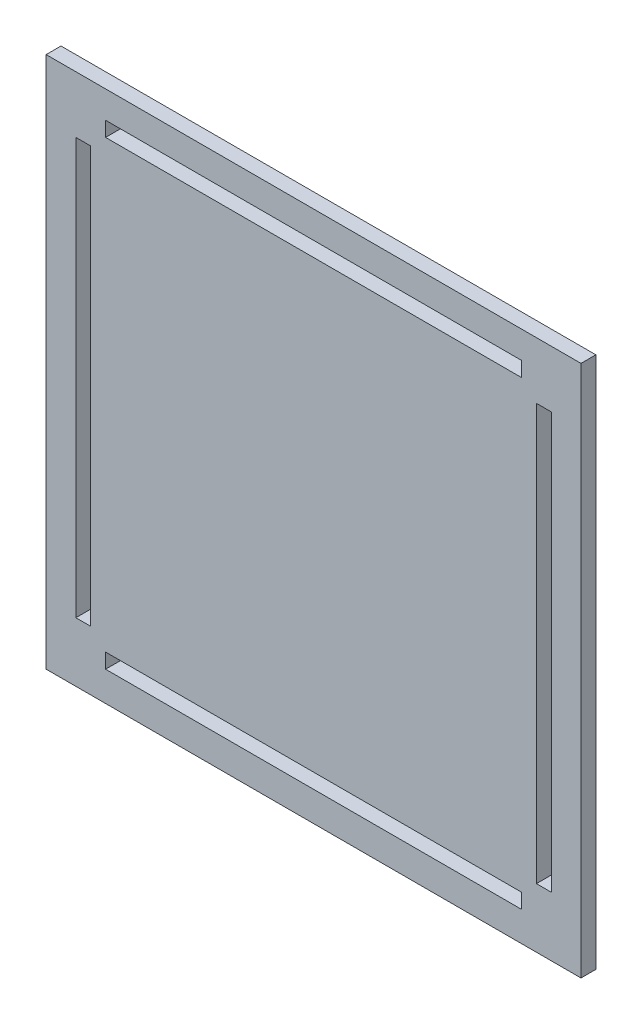
ISO-10303-21;
HEADER;
FILE_DESCRIPTION(('STEP AP214'),'2;1');
FILE_NAME('part.step','',(''),(''),'','','');
FILE_SCHEMA(('AUTOMOTIVE_DESIGN { 1 0 10303 214 1 1 1 1 }'));
ENDSEC;
DATA;
#1=APPLICATION_CONTEXT('core data for automotive mechanical design processes');
#2=APPLICATION_PROTOCOL_DEFINITION('international standard','automotive_design',2000,#1);
#3=PRODUCT_CONTEXT('',#1,'mechanical');
#4=PRODUCT('Part','Part','',(#3));
#5=PRODUCT_RELATED_PRODUCT_CATEGORY('part','',(#4));
#6=PRODUCT_DEFINITION_FORMATION('','',#4);
#7=PRODUCT_DEFINITION_CONTEXT('part definition',#1,'design');
#8=PRODUCT_DEFINITION('design','',#6,#7);
#9=PRODUCT_DEFINITION_SHAPE('','',#8);
#10=(LENGTH_UNIT() NAMED_UNIT(*) SI_UNIT(.MILLI.,.METRE.));
#11=(NAMED_UNIT(*) PLANE_ANGLE_UNIT() SI_UNIT($,.RADIAN.));
#12=(NAMED_UNIT(*) SI_UNIT($,.STERADIAN.) SOLID_ANGLE_UNIT());
#13=UNCERTAINTY_MEASURE_WITH_UNIT(LENGTH_MEASURE(1.E-05),#10,'distance_accuracy_value','');
#14=(GEOMETRIC_REPRESENTATION_CONTEXT(3) GLOBAL_UNCERTAINTY_ASSIGNED_CONTEXT((#13)) GLOBAL_UNIT_ASSIGNED_CONTEXT((#10,
#11,#12)) REPRESENTATION_CONTEXT('',''));
#15=CARTESIAN_POINT('',(0.,0.,0.));
#16=DIRECTION('',(0.,0.,1.));
#17=DIRECTION('',(1.,0.,0.));
#18=AXIS2_PLACEMENT_3D('',#15,#16,#17);
#19=CARTESIAN_POINT('',(0.,0.,5.));
#20=DIRECTION('',(0.,0.,1.));
#21=DIRECTION('',(1.,0.,0.));
#22=AXIS2_PLACEMENT_3D('',#19,#20,#21);
#23=PLANE('',#22);
#24=DIRECTION('',(0.,-1.,0.));
#25=VECTOR('',#24,1.);
#26=CARTESIAN_POINT('',(-90.,89.1405987204053,5.));
#27=LINE('',#26,#25);
#28=CARTESIAN_POINT('',(-90.,89.1405987204053,5.));
#29=VERTEX_POINT('',#28);
#30=CARTESIAN_POINT('',(-90.,-90.,5.));
#31=VERTEX_POINT('',#30);
#32=EDGE_CURVE('E309',#29,#31,#27,.T.);
#33=ORIENTED_EDGE('',*,*,#32,.T.);
#34=DIRECTION('',(1.,0.,0.));
#35=VECTOR('',#34,1.);
#36=CARTESIAN_POINT('',(-90.,-90.,5.));
#37=LINE('',#36,#35);
#38=CARTESIAN_POINT('',(90.,-90.,5.));
#39=VERTEX_POINT('',#38);
#40=EDGE_CURVE('E312',#31,#39,#37,.T.);
#41=ORIENTED_EDGE('',*,*,#40,.T.);
#42=DIRECTION('',(0.,1.,0.));
#43=VECTOR('',#42,1.);
#44=CARTESIAN_POINT('',(90.,89.1405987204053,5.));
#45=LINE('',#44,#43);
#46=CARTESIAN_POINT('',(90.,89.1405987204053,5.));
#47=VERTEX_POINT('',#46);
#48=EDGE_CURVE('E315',#39,#47,#45,.T.);
#49=ORIENTED_EDGE('',*,*,#48,.T.);
#50=DIRECTION('',(-1.,0.,0.));
#51=VECTOR('',#50,1.);
#52=CARTESIAN_POINT('',(-90.,89.1405987204053,5.));
#53=LINE('',#52,#51);
#54=EDGE_CURVE('E317',#47,#29,#53,.T.);
#55=ORIENTED_EDGE('',*,*,#54,.T.);
#56=EDGE_LOOP('',(#33,#41,#49,#55));
#57=FACE_BOUND('',#56,.T.);
#58=DIRECTION('',(0.,-1.,0.));
#59=VECTOR('',#58,1.);
#60=CARTESIAN_POINT('',(-70.0000000000001,80.0000000000041,5.));
#61=LINE('',#60,#59);
#62=CARTESIAN_POINT('',(-70.0000000000001,80.0000000000041,5.));
#63=VERTEX_POINT('',#62);
#64=CARTESIAN_POINT('',(-70.0000000000001,75.0000000000041,5.));
#65=VERTEX_POINT('',#64);
#66=EDGE_CURVE('E280',#63,#65,#61,.T.);
#67=ORIENTED_EDGE('',*,*,#66,.F.);
#68=DIRECTION('',(-1.,0.,0.));
#69=VECTOR('',#68,1.);
#70=CARTESIAN_POINT('',(69.9999999999999,80.0000000000041,5.));
#71=LINE('',#70,#69);
#72=CARTESIAN_POINT('',(69.9999999999999,80.0000000000041,5.));
#73=VERTEX_POINT('',#72);
#74=EDGE_CURVE('E278',#73,#63,#71,.T.);
#75=ORIENTED_EDGE('',*,*,#74,.F.);
#76=DIRECTION('',(0.,1.,0.));
#77=VECTOR('',#76,1.);
#78=CARTESIAN_POINT('',(69.9999999999999,80.0000000000041,5.));
#79=LINE('',#78,#77);
#80=CARTESIAN_POINT('',(69.9999999999999,75.0000000000041,5.));
#81=VERTEX_POINT('',#80);
#82=EDGE_CURVE('E286',#81,#73,#79,.T.);
#83=ORIENTED_EDGE('',*,*,#82,.F.);
#84=DIRECTION('',(1.,0.,0.));
#85=VECTOR('',#84,1.);
#86=CARTESIAN_POINT('',(69.9999999999999,75.0000000000041,5.));
#87=LINE('',#86,#85);
#88=EDGE_CURVE('E283',#65,#81,#87,.T.);
#89=ORIENTED_EDGE('',*,*,#88,.F.);
#90=EDGE_LOOP('',(#67,#75,#83,#89));
#91=FACE_BOUND('',#90,.T.);
#92=DIRECTION('',(1.,0.,0.));
#93=VECTOR('',#92,1.);
#94=CARTESIAN_POINT('',(-80.,-70.,5.));
#95=LINE('',#94,#93);
#96=CARTESIAN_POINT('',(-80.,-70.,5.));
#97=VERTEX_POINT('',#96);
#98=CARTESIAN_POINT('',(-75.,-70.,5.));
#99=VERTEX_POINT('',#98);
#100=EDGE_CURVE('E249',#97,#99,#95,.T.);
#101=ORIENTED_EDGE('',*,*,#100,.F.);
#102=DIRECTION('',(0.,-1.,0.));
#103=VECTOR('',#102,1.);
#104=CARTESIAN_POINT('',(-80.,70.,5.));
#105=LINE('',#104,#103);
#106=CARTESIAN_POINT('',(-80.,70.,5.));
#107=VERTEX_POINT('',#106);
#108=EDGE_CURVE('E247',#107,#97,#105,.T.);
#109=ORIENTED_EDGE('',*,*,#108,.F.);
#110=DIRECTION('',(-1.,0.,0.));
#111=VECTOR('',#110,1.);
#112=CARTESIAN_POINT('',(-80.,70.,5.));
#113=LINE('',#112,#111);
#114=CARTESIAN_POINT('',(-75.,70.,5.));
#115=VERTEX_POINT('',#114);
#116=EDGE_CURVE('E255',#115,#107,#113,.T.);
#117=ORIENTED_EDGE('',*,*,#116,.F.);
#118=DIRECTION('',(0.,1.,0.));
#119=VECTOR('',#118,1.);
#120=CARTESIAN_POINT('',(-75.,70.,5.));
#121=LINE('',#120,#119);
#122=EDGE_CURVE('E252',#99,#115,#121,.T.);
#123=ORIENTED_EDGE('',*,*,#122,.F.);
#124=EDGE_LOOP('',(#101,#109,#117,#123));
#125=FACE_BOUND('',#124,.T.);
#126=DIRECTION('',(-1.,0.,0.));
#127=VECTOR('',#126,1.);
#128=CARTESIAN_POINT('',(80.000000000004,70.0000000000042,5.));
#129=LINE('',#128,#127);
#130=CARTESIAN_POINT('',(80.000000000004,70.0000000000042,5.));
#131=VERTEX_POINT('',#130);
#132=CARTESIAN_POINT('',(75.000000000004,70.0000000000042,5.));
#133=VERTEX_POINT('',#132);
#134=EDGE_CURVE('E218',#131,#133,#129,.T.);
#135=ORIENTED_EDGE('',*,*,#134,.F.);
#136=DIRECTION('',(0.,1.,0.));
#137=VECTOR('',#136,1.);
#138=CARTESIAN_POINT('',(80.000000000004,-69.9999999999958,5.));
#139=LINE('',#138,#137);
#140=CARTESIAN_POINT('',(80.000000000004,-69.9999999999958,5.));
#141=VERTEX_POINT('',#140);
#142=EDGE_CURVE('E216',#141,#131,#139,.T.);
#143=ORIENTED_EDGE('',*,*,#142,.F.);
#144=DIRECTION('',(1.,0.,0.));
#145=VECTOR('',#144,1.);
#146=CARTESIAN_POINT('',(80.000000000004,-69.9999999999958,5.));
#147=LINE('',#146,#145);
#148=CARTESIAN_POINT('',(75.000000000004,-69.9999999999958,5.));
#149=VERTEX_POINT('',#148);
#150=EDGE_CURVE('E224',#149,#141,#147,.T.);
#151=ORIENTED_EDGE('',*,*,#150,.F.);
#152=DIRECTION('',(0.,-1.,0.));
#153=VECTOR('',#152,1.);
#154=CARTESIAN_POINT('',(75.000000000004,-69.9999999999958,5.));
#155=LINE('',#154,#153);
#156=EDGE_CURVE('E221',#133,#149,#155,.T.);
#157=ORIENTED_EDGE('',*,*,#156,.F.);
#158=EDGE_LOOP('',(#135,#143,#151,#157));
#159=FACE_BOUND('',#158,.T.);
#160=DIRECTION('',(0.,1.,0.));
#161=VECTOR('',#160,1.);
#162=CARTESIAN_POINT('',(70.0000000000041,-79.9999999999999,5.));
#163=LINE('',#162,#161);
#164=CARTESIAN_POINT('',(70.0000000000041,-79.9999999999999,5.));
#165=VERTEX_POINT('',#164);
#166=CARTESIAN_POINT('',(70.0000000000041,-74.9999999999999,5.));
#167=VERTEX_POINT('',#166);
#168=EDGE_CURVE('E188',#165,#167,#163,.T.);
#169=ORIENTED_EDGE('',*,*,#168,.F.);
#170=DIRECTION('',(1.,0.,0.));
#171=VECTOR('',#170,1.);
#172=CARTESIAN_POINT('',(-69.9999999999959,-79.9999999999999,5.));
#173=LINE('',#172,#171);
#174=CARTESIAN_POINT('',(-69.9999999999959,-79.9999999999999,5.));
#175=VERTEX_POINT('',#174);
#176=EDGE_CURVE('E180',#175,#165,#173,.T.);
#177=ORIENTED_EDGE('',*,*,#176,.F.);
#178=DIRECTION('',(0.,-1.,0.));
#179=VECTOR('',#178,1.);
#180=CARTESIAN_POINT('',(-69.9999999999959,-79.9999999999999,5.));
#181=LINE('',#180,#179);
#182=CARTESIAN_POINT('',(-69.9999999999959,-74.9999999999999,5.));
#183=VERTEX_POINT('',#182);
#184=EDGE_CURVE('E202',#183,#175,#181,.T.);
#185=ORIENTED_EDGE('',*,*,#184,.F.);
#186=DIRECTION('',(-1.,0.,0.));
#187=VECTOR('',#186,1.);
#188=CARTESIAN_POINT('',(-69.9999999999959,-74.9999999999999,5.));
#189=LINE('',#188,#187);
#190=EDGE_CURVE('E200',#167,#183,#189,.T.);
#191=ORIENTED_EDGE('',*,*,#190,.F.);
#192=EDGE_LOOP('',(#169,#177,#185,#191));
#193=FACE_BOUND('',#192,.T.);
#194=ADVANCED_FACE('F43',(#57,#91,#125,#159,#193),#23,.T.);
#195=CARTESIAN_POINT('',(0.,0.,0.));
#196=DIRECTION('',(0.,0.,1.));
#197=DIRECTION('',(1.,0.,0.));
#198=AXIS2_PLACEMENT_3D('',#195,#196,#197);
#199=PLANE('',#198);
#200=DIRECTION('',(0.,1.,0.));
#201=VECTOR('',#200,1.);
#202=CARTESIAN_POINT('',(80.000000000004,-69.9999999999958,0.));
#203=LINE('',#202,#201);
#204=CARTESIAN_POINT('',(80.000000000004,-69.9999999999958,0.));
#205=VERTEX_POINT('',#204);
#206=CARTESIAN_POINT('',(80.000000000004,70.0000000000042,0.));
#207=VERTEX_POINT('',#206);
#208=EDGE_CURVE('E196',#205,#207,#203,.T.);
#209=ORIENTED_EDGE('',*,*,#208,.T.);
#210=DIRECTION('',(-1.,0.,0.));
#211=VECTOR('',#210,1.);
#212=CARTESIAN_POINT('',(80.000000000004,70.0000000000042,0.));
#213=LINE('',#212,#211);
#214=CARTESIAN_POINT('',(75.000000000004,70.0000000000042,0.));
#215=VERTEX_POINT('',#214);
#216=EDGE_CURVE('E229',#207,#215,#213,.T.);
#217=ORIENTED_EDGE('',*,*,#216,.T.);
#218=DIRECTION('',(0.,-1.,0.));
#219=VECTOR('',#218,1.);
#220=CARTESIAN_POINT('',(75.000000000004,-69.9999999999958,0.));
#221=LINE('',#220,#219);
#222=CARTESIAN_POINT('',(75.000000000004,-69.9999999999958,0.));
#223=VERTEX_POINT('',#222);
#224=EDGE_CURVE('E232',#215,#223,#221,.T.);
#225=ORIENTED_EDGE('',*,*,#224,.T.);
#226=DIRECTION('',(1.,0.,0.));
#227=VECTOR('',#226,1.);
#228=CARTESIAN_POINT('',(80.000000000004,-69.9999999999958,0.));
#229=LINE('',#228,#227);
#230=EDGE_CURVE('E219',#223,#205,#229,.T.);
#231=ORIENTED_EDGE('',*,*,#230,.T.);
#232=EDGE_LOOP('',(#209,#217,#225,#231));
#233=FACE_BOUND('',#232,.T.);
#234=DIRECTION('',(-1.,0.,0.));
#235=VECTOR('',#234,1.);
#236=CARTESIAN_POINT('',(69.9999999999999,80.0000000000041,0.));
#237=LINE('',#236,#235);
#238=CARTESIAN_POINT('',(69.9999999999999,80.0000000000041,0.));
#239=VERTEX_POINT('',#238);
#240=CARTESIAN_POINT('',(-70.0000000000001,80.0000000000041,0.));
#241=VERTEX_POINT('',#240);
#242=EDGE_CURVE('E277',#239,#241,#237,.T.);
#243=ORIENTED_EDGE('',*,*,#242,.T.);
#244=DIRECTION('',(0.,-1.,0.));
#245=VECTOR('',#244,1.);
#246=CARTESIAN_POINT('',(-70.0000000000001,80.0000000000041,0.));
#247=LINE('',#246,#245);
#248=CARTESIAN_POINT('',(-70.0000000000001,75.0000000000041,0.));
#249=VERTEX_POINT('',#248);
#250=EDGE_CURVE('E291',#241,#249,#247,.T.);
#251=ORIENTED_EDGE('',*,*,#250,.T.);
#252=DIRECTION('',(1.,0.,0.));
#253=VECTOR('',#252,1.);
#254=CARTESIAN_POINT('',(69.9999999999999,75.0000000000041,0.));
#255=LINE('',#254,#253);
#256=CARTESIAN_POINT('',(69.9999999999999,75.0000000000041,0.));
#257=VERTEX_POINT('',#256);
#258=EDGE_CURVE('E294',#249,#257,#255,.T.);
#259=ORIENTED_EDGE('',*,*,#258,.T.);
#260=DIRECTION('',(0.,1.,0.));
#261=VECTOR('',#260,1.);
#262=CARTESIAN_POINT('',(69.9999999999999,80.0000000000041,0.));
#263=LINE('',#262,#261);
#264=EDGE_CURVE('E281',#257,#239,#263,.T.);
#265=ORIENTED_EDGE('',*,*,#264,.T.);
#266=EDGE_LOOP('',(#243,#251,#259,#265));
#267=FACE_BOUND('',#266,.T.);
#268=DIRECTION('',(0.,-1.,0.));
#269=VECTOR('',#268,1.);
#270=CARTESIAN_POINT('',(-90.,89.1405987204053,0.));
#271=LINE('',#270,#269);
#272=CARTESIAN_POINT('',(-90.,89.1405987204053,0.));
#273=VERTEX_POINT('',#272);
#274=CARTESIAN_POINT('',(-90.,-90.,0.));
#275=VERTEX_POINT('',#274);
#276=EDGE_CURVE('E308',#273,#275,#271,.T.);
#277=ORIENTED_EDGE('',*,*,#276,.F.);
#278=DIRECTION('',(-1.,0.,0.));
#279=VECTOR('',#278,1.);
#280=CARTESIAN_POINT('',(-90.,89.1405987204053,0.));
#281=LINE('',#280,#279);
#282=CARTESIAN_POINT('',(90.,89.1405987204053,0.));
#283=VERTEX_POINT('',#282);
#284=EDGE_CURVE('E313',#283,#273,#281,.T.);
#285=ORIENTED_EDGE('',*,*,#284,.F.);
#286=DIRECTION('',(0.,1.,0.));
#287=VECTOR('',#286,1.);
#288=CARTESIAN_POINT('',(90.,89.1405987204053,0.));
#289=LINE('',#288,#287);
#290=CARTESIAN_POINT('',(90.,-90.,0.));
#291=VERTEX_POINT('',#290);
#292=EDGE_CURVE('E324',#291,#283,#289,.T.);
#293=ORIENTED_EDGE('',*,*,#292,.F.);
#294=DIRECTION('',(1.,0.,0.));
#295=VECTOR('',#294,1.);
#296=CARTESIAN_POINT('',(-90.,-90.,0.));
#297=LINE('',#296,#295);
#298=EDGE_CURVE('E322',#275,#291,#297,.T.);
#299=ORIENTED_EDGE('',*,*,#298,.F.);
#300=EDGE_LOOP('',(#277,#285,#293,#299));
#301=FACE_BOUND('',#300,.T.);
#302=DIRECTION('',(0.,-1.,0.));
#303=VECTOR('',#302,1.);
#304=CARTESIAN_POINT('',(-80.,70.,0.));
#305=LINE('',#304,#303);
#306=CARTESIAN_POINT('',(-80.,70.,0.));
#307=VERTEX_POINT('',#306);
#308=CARTESIAN_POINT('',(-80.,-70.,0.));
#309=VERTEX_POINT('',#308);
#310=EDGE_CURVE('E246',#307,#309,#305,.T.);
#311=ORIENTED_EDGE('',*,*,#310,.T.);
#312=DIRECTION('',(1.,0.,0.));
#313=VECTOR('',#312,1.);
#314=CARTESIAN_POINT('',(-80.,-70.,0.));
#315=LINE('',#314,#313);
#316=CARTESIAN_POINT('',(-75.,-70.,0.));
#317=VERTEX_POINT('',#316);
#318=EDGE_CURVE('E260',#309,#317,#315,.T.);
#319=ORIENTED_EDGE('',*,*,#318,.T.);
#320=DIRECTION('',(0.,1.,0.));
#321=VECTOR('',#320,1.);
#322=CARTESIAN_POINT('',(-75.,70.,0.));
#323=LINE('',#322,#321);
#324=CARTESIAN_POINT('',(-75.,70.,0.));
#325=VERTEX_POINT('',#324);
#326=EDGE_CURVE('E263',#317,#325,#323,.T.);
#327=ORIENTED_EDGE('',*,*,#326,.T.);
#328=DIRECTION('',(-1.,0.,0.));
#329=VECTOR('',#328,1.);
#330=CARTESIAN_POINT('',(-80.,70.,0.));
#331=LINE('',#330,#329);
#332=EDGE_CURVE('E250',#325,#307,#331,.T.);
#333=ORIENTED_EDGE('',*,*,#332,.T.);
#334=EDGE_LOOP('',(#311,#319,#327,#333));
#335=FACE_BOUND('',#334,.T.);
#336=DIRECTION('',(1.,0.,0.));
#337=VECTOR('',#336,1.);
#338=CARTESIAN_POINT('',(-69.9999999999959,-79.9999999999999,0.));
#339=LINE('',#338,#337);
#340=CARTESIAN_POINT('',(-69.9999999999959,-79.9999999999999,0.));
#341=VERTEX_POINT('',#340);
#342=CARTESIAN_POINT('',(70.0000000000041,-79.9999999999999,0.));
#343=VERTEX_POINT('',#342);
#344=EDGE_CURVE('E66',#341,#343,#339,.T.);
#345=ORIENTED_EDGE('',*,*,#344,.T.);
#346=DIRECTION('',(0.,1.,0.));
#347=VECTOR('',#346,1.);
#348=CARTESIAN_POINT('',(70.0000000000041,-79.9999999999999,0.));
#349=LINE('',#348,#347);
#350=CARTESIAN_POINT('',(70.0000000000041,-74.9999999999999,0.));
#351=VERTEX_POINT('',#350);
#352=EDGE_CURVE('E195',#343,#351,#349,.T.);
#353=ORIENTED_EDGE('',*,*,#352,.T.);
#354=DIRECTION('',(-1.,0.,0.));
#355=VECTOR('',#354,1.);
#356=CARTESIAN_POINT('',(-69.9999999999959,-74.9999999999999,0.));
#357=LINE('',#356,#355);
#358=CARTESIAN_POINT('',(-69.9999999999959,-74.9999999999999,0.));
#359=VERTEX_POINT('',#358);
#360=EDGE_CURVE('E208',#351,#359,#357,.T.);
#361=ORIENTED_EDGE('',*,*,#360,.T.);
#362=DIRECTION('',(0.,-1.,0.));
#363=VECTOR('',#362,1.);
#364=CARTESIAN_POINT('',(-69.9999999999959,-79.9999999999999,0.));
#365=LINE('',#364,#363);
#366=EDGE_CURVE('E189',#359,#341,#365,.T.);
#367=ORIENTED_EDGE('',*,*,#366,.T.);
#368=EDGE_LOOP('',(#345,#353,#361,#367));
#369=FACE_BOUND('',#368,.T.);
#370=ADVANCED_FACE('F342',(#233,#267,#301,#335,#369),#199,.F.);
#371=CARTESIAN_POINT('',(-90.,89.1405987204053,5.));
#372=DIRECTION('',(1.,0.,0.));
#373=DIRECTION('',(0.,1.,0.));
#374=AXIS2_PLACEMENT_3D('',#371,#372,#373);
#375=PLANE('',#374);
#376=ORIENTED_EDGE('',*,*,#276,.T.);
#377=DIRECTION('',(0.,0.,-1.));
#378=VECTOR('',#377,1.);
#379=CARTESIAN_POINT('',(-90.,-90.,5.));
#380=LINE('',#379,#378);
#381=EDGE_CURVE('E11',#31,#275,#380,.T.);
#382=ORIENTED_EDGE('',*,*,#381,.F.);
#383=ORIENTED_EDGE('',*,*,#32,.F.);
#384=DIRECTION('',(0.,0.,-1.));
#385=VECTOR('',#384,1.);
#386=CARTESIAN_POINT('',(-90.,89.1405987204053,5.));
#387=LINE('',#386,#385);
#388=EDGE_CURVE('E319',#29,#273,#387,.T.);
#389=ORIENTED_EDGE('',*,*,#388,.T.);
#390=EDGE_LOOP('',(#376,#382,#383,#389));
#391=FACE_BOUND('',#390,.T.);
#392=ADVANCED_FACE('F45',(#391),#375,.F.);
#393=CARTESIAN_POINT('',(-90.,-90.,5.));
#394=DIRECTION('',(0.,1.,0.));
#395=DIRECTION('',(0.,0.,1.));
#396=AXIS2_PLACEMENT_3D('',#393,#394,#395);
#397=PLANE('',#396);
#398=ORIENTED_EDGE('',*,*,#298,.T.);
#399=DIRECTION('',(0.,0.,-1.));
#400=VECTOR('',#399,1.);
#401=CARTESIAN_POINT('',(90.,-90.,5.));
#402=LINE('',#401,#400);
#403=EDGE_CURVE('E51',#39,#291,#402,.T.);
#404=ORIENTED_EDGE('',*,*,#403,.F.);
#405=ORIENTED_EDGE('',*,*,#40,.F.);
#406=ORIENTED_EDGE('',*,*,#381,.T.);
#407=EDGE_LOOP('',(#398,#404,#405,#406));
#408=FACE_BOUND('',#407,.T.);
#409=ADVANCED_FACE('F353',(#408),#397,.F.);
#410=CARTESIAN_POINT('',(90.,89.1405987204053,5.));
#411=DIRECTION('',(-1.,0.,0.));
#412=DIRECTION('',(0.,-1.,0.));
#413=AXIS2_PLACEMENT_3D('',#410,#411,#412);
#414=PLANE('',#413);
#415=ORIENTED_EDGE('',*,*,#292,.T.);
#416=DIRECTION('',(0.,0.,-1.));
#417=VECTOR('',#416,1.);
#418=CARTESIAN_POINT('',(90.,89.1405987204053,5.));
#419=LINE('',#418,#417);
#420=EDGE_CURVE('E329',#47,#283,#419,.T.);
#421=ORIENTED_EDGE('',*,*,#420,.F.);
#422=ORIENTED_EDGE('',*,*,#48,.F.);
#423=ORIENTED_EDGE('',*,*,#403,.T.);
#424=EDGE_LOOP('',(#415,#421,#422,#423));
#425=FACE_BOUND('',#424,.T.);
#426=ADVANCED_FACE('F336',(#425),#414,.F.);
#427=CARTESIAN_POINT('',(-90.,89.1405987204053,5.));
#428=DIRECTION('',(0.,-1.,0.));
#429=DIRECTION('',(0.,0.,-1.));
#430=AXIS2_PLACEMENT_3D('',#427,#428,#429);
#431=PLANE('',#430);
#432=ORIENTED_EDGE('',*,*,#284,.T.);
#433=ORIENTED_EDGE('',*,*,#388,.F.);
#434=ORIENTED_EDGE('',*,*,#54,.F.);
#435=ORIENTED_EDGE('',*,*,#420,.T.);
#436=EDGE_LOOP('',(#432,#433,#434,#435));
#437=FACE_BOUND('',#436,.T.);
#438=ADVANCED_FACE('F346',(#437),#431,.F.);
#439=CARTESIAN_POINT('',(69.9999999999999,80.0000000000041,5.));
#440=DIRECTION('',(0.,-1.,0.));
#441=DIRECTION('',(1.,0.,0.));
#442=AXIS2_PLACEMENT_3D('',#439,#440,#441);
#443=PLANE('',#442);
#444=ORIENTED_EDGE('',*,*,#242,.F.);
#445=DIRECTION('',(0.,0.,-1.));
#446=VECTOR('',#445,1.);
#447=CARTESIAN_POINT('',(69.9999999999999,80.0000000000041,5.));
#448=LINE('',#447,#446);
#449=EDGE_CURVE('E288',#73,#239,#448,.T.);
#450=ORIENTED_EDGE('',*,*,#449,.F.);
#451=ORIENTED_EDGE('',*,*,#74,.T.);
#452=DIRECTION('',(0.,0.,-1.));
#453=VECTOR('',#452,1.);
#454=CARTESIAN_POINT('',(-70.0000000000001,80.0000000000041,5.));
#455=LINE('',#454,#453);
#456=EDGE_CURVE('E305',#63,#241,#455,.T.);
#457=ORIENTED_EDGE('',*,*,#456,.T.);
#458=EDGE_LOOP('',(#444,#450,#451,#457));
#459=FACE_BOUND('',#458,.T.);
#460=ADVANCED_FACE('F368',(#459),#443,.T.);
#461=CARTESIAN_POINT('',(-70.0000000000001,80.0000000000041,5.));
#462=DIRECTION('',(1.,0.,0.));
#463=DIRECTION('',(0.,0.,-1.));
#464=AXIS2_PLACEMENT_3D('',#461,#462,#463);
#465=PLANE('',#464);
#466=ORIENTED_EDGE('',*,*,#250,.F.);
#467=ORIENTED_EDGE('',*,*,#456,.F.);
#468=ORIENTED_EDGE('',*,*,#66,.T.);
#469=DIRECTION('',(0.,0.,-1.));
#470=VECTOR('',#469,1.);
#471=CARTESIAN_POINT('',(-70.0000000000001,75.0000000000041,5.));
#472=LINE('',#471,#470);
#473=EDGE_CURVE('E303',#65,#249,#472,.T.);
#474=ORIENTED_EDGE('',*,*,#473,.T.);
#475=EDGE_LOOP('',(#466,#467,#468,#474));
#476=FACE_BOUND('',#475,.T.);
#477=ADVANCED_FACE('F375',(#476),#465,.T.);
#478=CARTESIAN_POINT('',(69.9999999999999,75.0000000000041,5.));
#479=DIRECTION('',(0.,1.,0.));
#480=DIRECTION('',(-1.,0.,0.));
#481=AXIS2_PLACEMENT_3D('',#478,#479,#480);
#482=PLANE('',#481);
#483=ORIENTED_EDGE('',*,*,#258,.F.);
#484=ORIENTED_EDGE('',*,*,#473,.F.);
#485=ORIENTED_EDGE('',*,*,#88,.T.);
#486=DIRECTION('',(0.,0.,-1.));
#487=VECTOR('',#486,1.);
#488=CARTESIAN_POINT('',(69.9999999999999,75.0000000000041,5.));
#489=LINE('',#488,#487);
#490=EDGE_CURVE('E301',#81,#257,#489,.T.);
#491=ORIENTED_EDGE('',*,*,#490,.T.);
#492=EDGE_LOOP('',(#483,#484,#485,#491));
#493=FACE_BOUND('',#492,.T.);
#494=ADVANCED_FACE('F380',(#493),#482,.T.);
#495=CARTESIAN_POINT('',(69.9999999999999,80.0000000000041,5.));
#496=DIRECTION('',(-1.,0.,0.));
#497=DIRECTION('',(0.,0.,1.));
#498=AXIS2_PLACEMENT_3D('',#495,#496,#497);
#499=PLANE('',#498);
#500=ORIENTED_EDGE('',*,*,#264,.F.);
#501=ORIENTED_EDGE('',*,*,#490,.F.);
#502=ORIENTED_EDGE('',*,*,#82,.T.);
#503=ORIENTED_EDGE('',*,*,#449,.T.);
#504=EDGE_LOOP('',(#500,#501,#502,#503));
#505=FACE_BOUND('',#504,.T.);
#506=ADVANCED_FACE('F388',(#505),#499,.T.);
#507=CARTESIAN_POINT('',(-80.,70.,5.));
#508=DIRECTION('',(1.,0.,0.));
#509=DIRECTION('',(0.,1.,0.));
#510=AXIS2_PLACEMENT_3D('',#507,#508,#509);
#511=PLANE('',#510);
#512=ORIENTED_EDGE('',*,*,#310,.F.);
#513=DIRECTION('',(0.,0.,-1.));
#514=VECTOR('',#513,1.);
#515=CARTESIAN_POINT('',(-80.,70.,5.));
#516=LINE('',#515,#514);
#517=EDGE_CURVE('E257',#107,#307,#516,.T.);
#518=ORIENTED_EDGE('',*,*,#517,.F.);
#519=ORIENTED_EDGE('',*,*,#108,.T.);
#520=DIRECTION('',(0.,0.,-1.));
#521=VECTOR('',#520,1.);
#522=CARTESIAN_POINT('',(-80.,-70.,5.));
#523=LINE('',#522,#521);
#524=EDGE_CURVE('E274',#97,#309,#523,.T.);
#525=ORIENTED_EDGE('',*,*,#524,.T.);
#526=EDGE_LOOP('',(#512,#518,#519,#525));
#527=FACE_BOUND('',#526,.T.);
#528=ADVANCED_FACE('F442',(#527),#511,.T.);
#529=CARTESIAN_POINT('',(-80.,-70.,5.));
#530=DIRECTION('',(0.,1.,0.));
#531=DIRECTION('',(0.,0.,1.));
#532=AXIS2_PLACEMENT_3D('',#529,#530,#531);
#533=PLANE('',#532);
#534=ORIENTED_EDGE('',*,*,#318,.F.);
#535=ORIENTED_EDGE('',*,*,#524,.F.);
#536=ORIENTED_EDGE('',*,*,#100,.T.);
#537=DIRECTION('',(0.,0.,-1.));
#538=VECTOR('',#537,1.);
#539=CARTESIAN_POINT('',(-75.,-70.,5.));
#540=LINE('',#539,#538);
#541=EDGE_CURVE('E272',#99,#317,#540,.T.);
#542=ORIENTED_EDGE('',*,*,#541,.T.);
#543=EDGE_LOOP('',(#534,#535,#536,#542));
#544=FACE_BOUND('',#543,.T.);
#545=ADVANCED_FACE('F438',(#544),#533,.T.);
#546=CARTESIAN_POINT('',(-75.,70.,5.));
#547=DIRECTION('',(-1.,0.,0.));
#548=DIRECTION('',(0.,-1.,0.));
#549=AXIS2_PLACEMENT_3D('',#546,#547,#548);
#550=PLANE('',#549);
#551=ORIENTED_EDGE('',*,*,#326,.F.);
#552=ORIENTED_EDGE('',*,*,#541,.F.);
#553=ORIENTED_EDGE('',*,*,#122,.T.);
#554=DIRECTION('',(0.,0.,-1.));
#555=VECTOR('',#554,1.);
#556=CARTESIAN_POINT('',(-75.,70.,5.));
#557=LINE('',#556,#555);
#558=EDGE_CURVE('E270',#115,#325,#557,.T.);
#559=ORIENTED_EDGE('',*,*,#558,.T.);
#560=EDGE_LOOP('',(#551,#552,#553,#559));
#561=FACE_BOUND('',#560,.T.);
#562=ADVANCED_FACE('F434',(#561),#550,.T.);
#563=CARTESIAN_POINT('',(-80.,70.,5.));
#564=DIRECTION('',(0.,-1.,0.));
#565=DIRECTION('',(0.,0.,-1.));
#566=AXIS2_PLACEMENT_3D('',#563,#564,#565);
#567=PLANE('',#566);
#568=ORIENTED_EDGE('',*,*,#332,.F.);
#569=ORIENTED_EDGE('',*,*,#558,.F.);
#570=ORIENTED_EDGE('',*,*,#116,.T.);
#571=ORIENTED_EDGE('',*,*,#517,.T.);
#572=EDGE_LOOP('',(#568,#569,#570,#571));
#573=FACE_BOUND('',#572,.T.);
#574=ADVANCED_FACE('F431',(#573),#567,.T.);
#575=CARTESIAN_POINT('',(80.000000000004,-69.9999999999958,5.));
#576=DIRECTION('',(-1.,0.,0.));
#577=DIRECTION('',(0.,-1.,0.));
#578=AXIS2_PLACEMENT_3D('',#575,#576,#577);
#579=PLANE('',#578);
#580=ORIENTED_EDGE('',*,*,#208,.F.);
#581=DIRECTION('',(0.,0.,-1.));
#582=VECTOR('',#581,1.);
#583=CARTESIAN_POINT('',(80.000000000004,-69.9999999999958,5.));
#584=LINE('',#583,#582);
#585=EDGE_CURVE('E226',#141,#205,#584,.T.);
#586=ORIENTED_EDGE('',*,*,#585,.F.);
#587=ORIENTED_EDGE('',*,*,#142,.T.);
#588=DIRECTION('',(0.,0.,-1.));
#589=VECTOR('',#588,1.);
#590=CARTESIAN_POINT('',(80.000000000004,70.0000000000042,5.));
#591=LINE('',#590,#589);
#592=EDGE_CURVE('E243',#131,#207,#591,.T.);
#593=ORIENTED_EDGE('',*,*,#592,.T.);
#594=EDGE_LOOP('',(#580,#586,#587,#593));
#595=FACE_BOUND('',#594,.T.);
#596=ADVANCED_FACE('F413',(#595),#579,.T.);
#597=CARTESIAN_POINT('',(80.000000000004,70.0000000000042,5.));
#598=DIRECTION('',(0.,-1.,0.));
#599=DIRECTION('',(0.,0.,-1.));
#600=AXIS2_PLACEMENT_3D('',#597,#598,#599);
#601=PLANE('',#600);
#602=ORIENTED_EDGE('',*,*,#216,.F.);
#603=ORIENTED_EDGE('',*,*,#592,.F.);
#604=ORIENTED_EDGE('',*,*,#134,.T.);
#605=DIRECTION('',(0.,0.,-1.));
#606=VECTOR('',#605,1.);
#607=CARTESIAN_POINT('',(75.000000000004,70.0000000000042,5.));
#608=LINE('',#607,#606);
#609=EDGE_CURVE('E241',#133,#215,#608,.T.);
#610=ORIENTED_EDGE('',*,*,#609,.T.);
#611=EDGE_LOOP('',(#602,#603,#604,#610));
#612=FACE_BOUND('',#611,.T.);
#613=ADVANCED_FACE('F407',(#612),#601,.T.);
#614=CARTESIAN_POINT('',(75.000000000004,-69.9999999999958,5.));
#615=DIRECTION('',(1.,0.,0.));
#616=DIRECTION('',(0.,1.,0.));
#617=AXIS2_PLACEMENT_3D('',#614,#615,#616);
#618=PLANE('',#617);
#619=ORIENTED_EDGE('',*,*,#224,.F.);
#620=ORIENTED_EDGE('',*,*,#609,.F.);
#621=ORIENTED_EDGE('',*,*,#156,.T.);
#622=DIRECTION('',(0.,0.,-1.));
#623=VECTOR('',#622,1.);
#624=CARTESIAN_POINT('',(75.000000000004,-69.9999999999958,5.));
#625=LINE('',#624,#623);
#626=EDGE_CURVE('E239',#149,#223,#625,.T.);
#627=ORIENTED_EDGE('',*,*,#626,.T.);
#628=EDGE_LOOP('',(#619,#620,#621,#627));
#629=FACE_BOUND('',#628,.T.);
#630=ADVANCED_FACE('F410',(#629),#618,.T.);
#631=CARTESIAN_POINT('',(80.000000000004,-69.9999999999958,5.));
#632=DIRECTION('',(0.,1.,0.));
#633=DIRECTION('',(0.,0.,1.));
#634=AXIS2_PLACEMENT_3D('',#631,#632,#633);
#635=PLANE('',#634);
#636=ORIENTED_EDGE('',*,*,#230,.F.);
#637=ORIENTED_EDGE('',*,*,#626,.F.);
#638=ORIENTED_EDGE('',*,*,#150,.T.);
#639=ORIENTED_EDGE('',*,*,#585,.T.);
#640=EDGE_LOOP('',(#636,#637,#638,#639));
#641=FACE_BOUND('',#640,.T.);
#642=ADVANCED_FACE('F416',(#641),#635,.T.);
#643=CARTESIAN_POINT('',(-69.9999999999959,-79.9999999999999,5.));
#644=DIRECTION('',(0.,1.,0.));
#645=DIRECTION('',(-1.,0.,0.));
#646=AXIS2_PLACEMENT_3D('',#643,#644,#645);
#647=PLANE('',#646);
#648=ORIENTED_EDGE('',*,*,#344,.F.);
#649=DIRECTION('',(0.,0.,-1.));
#650=VECTOR('',#649,1.);
#651=CARTESIAN_POINT('',(-69.9999999999959,-79.9999999999999,5.));
#652=LINE('',#651,#650);
#653=EDGE_CURVE('E184',#175,#341,#652,.T.);
#654=ORIENTED_EDGE('',*,*,#653,.F.);
#655=ORIENTED_EDGE('',*,*,#176,.T.);
#656=DIRECTION('',(0.,0.,-1.));
#657=VECTOR('',#656,1.);
#658=CARTESIAN_POINT('',(70.0000000000041,-79.9999999999999,5.));
#659=LINE('',#658,#657);
#660=EDGE_CURVE('E183',#165,#343,#659,.T.);
#661=ORIENTED_EDGE('',*,*,#660,.T.);
#662=EDGE_LOOP('',(#648,#654,#655,#661));
#663=FACE_BOUND('',#662,.T.);
#664=ADVANCED_FACE('F182',(#663),#647,.T.);
#665=CARTESIAN_POINT('',(70.0000000000041,-79.9999999999999,5.));
#666=DIRECTION('',(-1.,0.,0.));
#667=DIRECTION('',(0.,0.,1.));
#668=AXIS2_PLACEMENT_3D('',#665,#666,#667);
#669=PLANE('',#668);
#670=ORIENTED_EDGE('',*,*,#352,.F.);
#671=ORIENTED_EDGE('',*,*,#660,.F.);
#672=ORIENTED_EDGE('',*,*,#168,.T.);
#673=DIRECTION('',(0.,0.,-1.));
#674=VECTOR('',#673,1.);
#675=CARTESIAN_POINT('',(70.0000000000041,-74.9999999999999,5.));
#676=LINE('',#675,#674);
#677=EDGE_CURVE('E197',#167,#351,#676,.T.);
#678=ORIENTED_EDGE('',*,*,#677,.T.);
#679=EDGE_LOOP('',(#670,#671,#672,#678));
#680=FACE_BOUND('',#679,.T.);
#681=ADVANCED_FACE('F192',(#680),#669,.T.);
#682=CARTESIAN_POINT('',(-69.9999999999959,-74.9999999999999,5.));
#683=DIRECTION('',(0.,-1.,0.));
#684=DIRECTION('',(1.,0.,0.));
#685=AXIS2_PLACEMENT_3D('',#682,#683,#684);
#686=PLANE('',#685);
#687=ORIENTED_EDGE('',*,*,#360,.F.);
#688=ORIENTED_EDGE('',*,*,#677,.F.);
#689=ORIENTED_EDGE('',*,*,#190,.T.);
#690=DIRECTION('',(0.,0.,-1.));
#691=VECTOR('',#690,1.);
#692=CARTESIAN_POINT('',(-69.9999999999959,-74.9999999999999,5.));
#693=LINE('',#692,#691);
#694=EDGE_CURVE('E58',#183,#359,#693,.T.);
#695=ORIENTED_EDGE('',*,*,#694,.T.);
#696=EDGE_LOOP('',(#687,#688,#689,#695));
#697=FACE_BOUND('',#696,.T.);
#698=ADVANCED_FACE('F514',(#697),#686,.T.);
#699=CARTESIAN_POINT('',(-69.9999999999959,-79.9999999999999,5.));
#700=DIRECTION('',(1.,0.,0.));
#701=DIRECTION('',(0.,0.,-1.));
#702=AXIS2_PLACEMENT_3D('',#699,#700,#701);
#703=PLANE('',#702);
#704=ORIENTED_EDGE('',*,*,#366,.F.);
#705=ORIENTED_EDGE('',*,*,#694,.F.);
#706=ORIENTED_EDGE('',*,*,#184,.T.);
#707=ORIENTED_EDGE('',*,*,#653,.T.);
#708=EDGE_LOOP('',(#704,#705,#706,#707));
#709=FACE_BOUND('',#708,.T.);
#710=ADVANCED_FACE('F522',(#709),#703,.T.);
#711=CLOSED_SHELL('',(#194,#370,#392,#409,#426,#438,#460,#477,#494,#506,#528,#545,#562,#574,
#596,#613,#630,#642,#664,#681,#698,#710));
#712=MANIFOLD_SOLID_BREP('B2',#711);
#713=ADVANCED_BREP_SHAPE_REPRESENTATION('',(#18,#712),#14);
#714=SHAPE_DEFINITION_REPRESENTATION(#9,#713);
ENDSEC;
END-ISO-10303-21;
